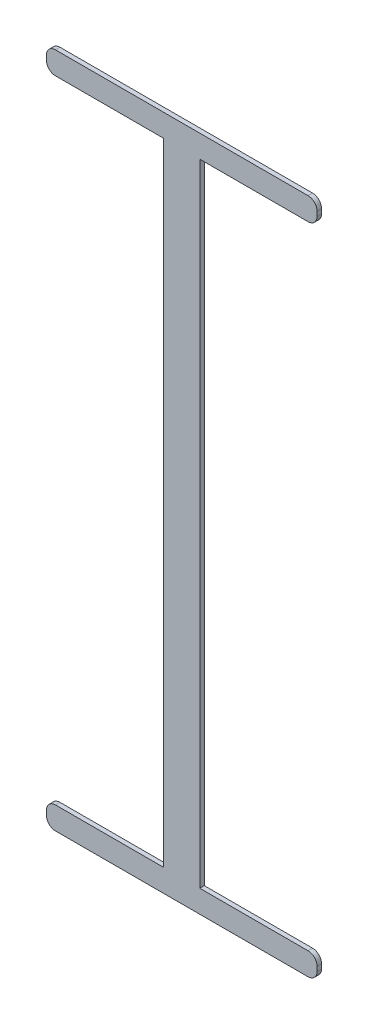
ISO-10303-21;
HEADER;
FILE_DESCRIPTION(('STEP AP214'),'2;1');
FILE_NAME('part.step','',(''),(''),'','','');
FILE_SCHEMA(('AUTOMOTIVE_DESIGN { 1 0 10303 214 1 1 1 1 }'));
ENDSEC;
DATA;
#1=APPLICATION_CONTEXT('core data for automotive mechanical design processes');
#2=APPLICATION_PROTOCOL_DEFINITION('international standard','automotive_design',2000,#1);
#3=PRODUCT_CONTEXT('',#1,'mechanical');
#4=PRODUCT('Part','Part','',(#3));
#5=PRODUCT_RELATED_PRODUCT_CATEGORY('part','',(#4));
#6=PRODUCT_DEFINITION_FORMATION('','',#4);
#7=PRODUCT_DEFINITION_CONTEXT('part definition',#1,'design');
#8=PRODUCT_DEFINITION('design','',#6,#7);
#9=PRODUCT_DEFINITION_SHAPE('','',#8);
#10=(LENGTH_UNIT() NAMED_UNIT(*) SI_UNIT(.MILLI.,.METRE.));
#11=(NAMED_UNIT(*) PLANE_ANGLE_UNIT() SI_UNIT($,.RADIAN.));
#12=(NAMED_UNIT(*) SI_UNIT($,.STERADIAN.) SOLID_ANGLE_UNIT());
#13=UNCERTAINTY_MEASURE_WITH_UNIT(LENGTH_MEASURE(1.E-05),#10,'distance_accuracy_value','');
#14=(GEOMETRIC_REPRESENTATION_CONTEXT(3) GLOBAL_UNCERTAINTY_ASSIGNED_CONTEXT((#13)) GLOBAL_UNIT_ASSIGNED_CONTEXT((#10,
#11,#12)) REPRESENTATION_CONTEXT('',''));
#15=CARTESIAN_POINT('',(0.,0.,0.));
#16=DIRECTION('',(0.,0.,1.));
#17=DIRECTION('',(1.,0.,0.));
#18=AXIS2_PLACEMENT_3D('',#15,#16,#17);
#19=CARTESIAN_POINT('',(8.00000000000002,140.,2.));
#20=DIRECTION('',(-1.,0.,0.));
#21=DIRECTION('',(0.,0.,1.));
#22=AXIS2_PLACEMENT_3D('',#19,#20,#21);
#23=PLANE('',#22);
#24=DIRECTION('',(0.,1.,0.));
#25=VECTOR('',#24,1.);
#26=CARTESIAN_POINT('',(8.00000000000002,140.,0.));
#27=LINE('',#26,#25);
#28=CARTESIAN_POINT('',(8.00000000000002,-140.,0.));
#29=VERTEX_POINT('',#28);
#30=CARTESIAN_POINT('',(8.00000000000002,140.,0.));
#31=VERTEX_POINT('',#30);
#32=EDGE_CURVE('E204',#29,#31,#27,.T.);
#33=ORIENTED_EDGE('',*,*,#32,.T.);
#34=DIRECTION('',(0.,0.,-1.));
#35=VECTOR('',#34,1.);
#36=CARTESIAN_POINT('',(8.00000000000002,140.,2.));
#37=LINE('',#36,#35);
#38=CARTESIAN_POINT('',(8.00000000000002,140.,2.));
#39=VERTEX_POINT('',#38);
#40=EDGE_CURVE('E11',#39,#31,#37,.T.);
#41=ORIENTED_EDGE('',*,*,#40,.F.);
#42=DIRECTION('',(0.,1.,0.));
#43=VECTOR('',#42,1.);
#44=CARTESIAN_POINT('',(8.00000000000002,140.,2.));
#45=LINE('',#44,#43);
#46=CARTESIAN_POINT('',(8.00000000000002,-140.,2.));
#47=VERTEX_POINT('',#46);
#48=EDGE_CURVE('E242',#47,#39,#45,.T.);
#49=ORIENTED_EDGE('',*,*,#48,.F.);
#50=DIRECTION('',(0.,0.,-1.));
#51=VECTOR('',#50,1.);
#52=CARTESIAN_POINT('',(8.00000000000002,-140.,2.));
#53=LINE('',#52,#51);
#54=EDGE_CURVE('E200',#47,#29,#53,.T.);
#55=ORIENTED_EDGE('',*,*,#54,.T.);
#56=EDGE_LOOP('',(#33,#41,#49,#55));
#57=FACE_BOUND('',#56,.T.);
#58=ADVANCED_FACE('F36',(#57),#23,.F.);
#59=CARTESIAN_POINT('',(56.,140.,2.));
#60=DIRECTION('',(0.,1.,0.));
#61=DIRECTION('',(-1.,0.,0.));
#62=AXIS2_PLACEMENT_3D('',#59,#60,#61);
#63=PLANE('',#62);
#64=DIRECTION('',(1.,0.,0.));
#65=VECTOR('',#64,1.);
#66=CARTESIAN_POINT('',(56.,140.,0.));
#67=LINE('',#66,#65);
#68=CARTESIAN_POINT('',(56.,140.,0.));
#69=VERTEX_POINT('',#68);
#70=EDGE_CURVE('E207',#31,#69,#67,.T.);
#71=ORIENTED_EDGE('',*,*,#70,.T.);
#72=DIRECTION('',(0.,0.,-1.));
#73=VECTOR('',#72,1.);
#74=CARTESIAN_POINT('',(56.,140.,2.));
#75=LINE('',#74,#73);
#76=CARTESIAN_POINT('',(56.,140.,2.));
#77=VERTEX_POINT('',#76);
#78=EDGE_CURVE('E44',#77,#69,#75,.T.);
#79=ORIENTED_EDGE('',*,*,#78,.F.);
#80=DIRECTION('',(1.,0.,0.));
#81=VECTOR('',#80,1.);
#82=CARTESIAN_POINT('',(56.,140.,2.));
#83=LINE('',#82,#81);
#84=EDGE_CURVE('E131',#39,#77,#83,.T.);
#85=ORIENTED_EDGE('',*,*,#84,.F.);
#86=ORIENTED_EDGE('',*,*,#40,.T.);
#87=EDGE_LOOP('',(#71,#79,#85,#86));
#88=FACE_BOUND('',#87,.T.);
#89=ADVANCED_FACE('F360',(#88),#63,.F.);
#90=CARTESIAN_POINT('',(56.,144.,2.));
#91=DIRECTION('',(0.,0.,-1.));
#92=DIRECTION('',(-1.,0.,0.));
#93=AXIS2_PLACEMENT_3D('',#90,#91,#92);
#94=CYLINDRICAL_SURFACE('',#93,4.00000000000001);
#95=CARTESIAN_POINT('',(56.,144.,0.));
#96=DIRECTION('',(0.,0.,1.));
#97=DIRECTION('',(1.,0.,0.));
#98=AXIS2_PLACEMENT_3D('',#95,#96,#97);
#99=CIRCLE('',#98,4.00000000000001);
#100=CARTESIAN_POINT('',(60.,144.,0.));
#101=VERTEX_POINT('',#100);
#102=EDGE_CURVE('E209',#69,#101,#99,.T.);
#103=ORIENTED_EDGE('',*,*,#102,.T.);
#104=DIRECTION('',(0.,0.,-1.));
#105=VECTOR('',#104,1.);
#106=CARTESIAN_POINT('',(60.,144.,2.));
#107=LINE('',#106,#105);
#108=CARTESIAN_POINT('',(60.,144.,2.));
#109=VERTEX_POINT('',#108);
#110=EDGE_CURVE('E285',#109,#101,#107,.T.);
#111=ORIENTED_EDGE('',*,*,#110,.F.);
#112=CARTESIAN_POINT('',(56.,144.,2.));
#113=DIRECTION('',(0.,0.,1.));
#114=DIRECTION('',(1.,0.,0.));
#115=AXIS2_PLACEMENT_3D('',#112,#113,#114);
#116=CIRCLE('',#115,4.00000000000001);
#117=EDGE_CURVE('E293',#77,#109,#116,.T.);
#118=ORIENTED_EDGE('',*,*,#117,.F.);
#119=ORIENTED_EDGE('',*,*,#78,.T.);
#120=EDGE_LOOP('',(#103,#111,#118,#119));
#121=FACE_BOUND('',#120,.T.);
#122=ADVANCED_FACE('F291',(#121),#94,.T.);
#123=CARTESIAN_POINT('',(60.,146.,2.));
#124=DIRECTION('',(-1.,0.,0.));
#125=DIRECTION('',(0.,-1.,0.));
#126=AXIS2_PLACEMENT_3D('',#123,#124,#125);
#127=PLANE('',#126);
#128=DIRECTION('',(0.,1.,0.));
#129=VECTOR('',#128,1.);
#130=CARTESIAN_POINT('',(60.,146.,0.));
#131=LINE('',#130,#129);
#132=CARTESIAN_POINT('',(60.,146.,0.));
#133=VERTEX_POINT('',#132);
#134=EDGE_CURVE('E211',#101,#133,#131,.T.);
#135=ORIENTED_EDGE('',*,*,#134,.T.);
#136=DIRECTION('',(0.,0.,-1.));
#137=VECTOR('',#136,1.);
#138=CARTESIAN_POINT('',(60.,146.,2.));
#139=LINE('',#138,#137);
#140=CARTESIAN_POINT('',(60.,146.,2.));
#141=VERTEX_POINT('',#140);
#142=EDGE_CURVE('E282',#141,#133,#139,.T.);
#143=ORIENTED_EDGE('',*,*,#142,.F.);
#144=DIRECTION('',(0.,1.,0.));
#145=VECTOR('',#144,1.);
#146=CARTESIAN_POINT('',(60.,146.,2.));
#147=LINE('',#146,#145);
#148=EDGE_CURVE('E311',#109,#141,#147,.T.);
#149=ORIENTED_EDGE('',*,*,#148,.F.);
#150=ORIENTED_EDGE('',*,*,#110,.T.);
#151=EDGE_LOOP('',(#135,#143,#149,#150));
#152=FACE_BOUND('',#151,.T.);
#153=ADVANCED_FACE('F302',(#152),#127,.F.);
#154=CARTESIAN_POINT('',(56.,146.,2.));
#155=DIRECTION('',(0.,0.,-1.));
#156=DIRECTION('',(-1.,0.,0.));
#157=AXIS2_PLACEMENT_3D('',#154,#155,#156);
#158=CYLINDRICAL_SURFACE('',#157,4.);
#159=CARTESIAN_POINT('',(56.,146.,0.));
#160=DIRECTION('',(0.,0.,1.));
#161=DIRECTION('',(1.,0.,0.));
#162=AXIS2_PLACEMENT_3D('',#159,#160,#161);
#163=CIRCLE('',#162,4.);
#164=CARTESIAN_POINT('',(56.,150.,0.));
#165=VERTEX_POINT('',#164);
#166=EDGE_CURVE('E213',#133,#165,#163,.T.);
#167=ORIENTED_EDGE('',*,*,#166,.T.);
#168=DIRECTION('',(0.,0.,-1.));
#169=VECTOR('',#168,1.);
#170=CARTESIAN_POINT('',(56.,150.,2.));
#171=LINE('',#170,#169);
#172=CARTESIAN_POINT('',(56.,150.,2.));
#173=VERTEX_POINT('',#172);
#174=EDGE_CURVE('E279',#173,#165,#171,.T.);
#175=ORIENTED_EDGE('',*,*,#174,.F.);
#176=CARTESIAN_POINT('',(56.,146.,2.));
#177=DIRECTION('',(0.,0.,1.));
#178=DIRECTION('',(1.,0.,0.));
#179=AXIS2_PLACEMENT_3D('',#176,#177,#178);
#180=CIRCLE('',#179,4.);
#181=EDGE_CURVE('E308',#141,#173,#180,.T.);
#182=ORIENTED_EDGE('',*,*,#181,.F.);
#183=ORIENTED_EDGE('',*,*,#142,.T.);
#184=EDGE_LOOP('',(#167,#175,#182,#183));
#185=FACE_BOUND('',#184,.T.);
#186=ADVANCED_FACE('F306',(#185),#158,.T.);
#187=CARTESIAN_POINT('',(-56.,150.,2.));
#188=DIRECTION('',(0.,-1.,0.));
#189=DIRECTION('',(0.,0.,-1.));
#190=AXIS2_PLACEMENT_3D('',#187,#188,#189);
#191=PLANE('',#190);
#192=DIRECTION('',(-1.,0.,0.));
#193=VECTOR('',#192,1.);
#194=CARTESIAN_POINT('',(-56.,150.,0.));
#195=LINE('',#194,#193);
#196=CARTESIAN_POINT('',(-56.,150.,0.));
#197=VERTEX_POINT('',#196);
#198=EDGE_CURVE('E215',#165,#197,#195,.T.);
#199=ORIENTED_EDGE('',*,*,#198,.T.);
#200=DIRECTION('',(0.,0.,-1.));
#201=VECTOR('',#200,1.);
#202=CARTESIAN_POINT('',(-56.,150.,2.));
#203=LINE('',#202,#201);
#204=CARTESIAN_POINT('',(-56.,150.,2.));
#205=VERTEX_POINT('',#204);
#206=EDGE_CURVE('E276',#205,#197,#203,.T.);
#207=ORIENTED_EDGE('',*,*,#206,.F.);
#208=DIRECTION('',(-1.,0.,0.));
#209=VECTOR('',#208,1.);
#210=CARTESIAN_POINT('',(-56.,150.,2.));
#211=LINE('',#210,#209);
#212=EDGE_CURVE('E310',#173,#205,#211,.T.);
#213=ORIENTED_EDGE('',*,*,#212,.F.);
#214=ORIENTED_EDGE('',*,*,#174,.T.);
#215=EDGE_LOOP('',(#199,#207,#213,#214));
#216=FACE_BOUND('',#215,.T.);
#217=ADVANCED_FACE('F373',(#216),#191,.F.);
#218=CARTESIAN_POINT('',(-56.,146.,2.));
#219=DIRECTION('',(0.,0.,-1.));
#220=DIRECTION('',(-1.,0.,0.));
#221=AXIS2_PLACEMENT_3D('',#218,#219,#220);
#222=CYLINDRICAL_SURFACE('',#221,4.);
#223=CARTESIAN_POINT('',(-56.,146.,0.));
#224=DIRECTION('',(0.,0.,1.));
#225=DIRECTION('',(-1.,0.,0.));
#226=AXIS2_PLACEMENT_3D('',#223,#224,#225);
#227=CIRCLE('',#226,4.);
#228=CARTESIAN_POINT('',(-60.,146.,0.));
#229=VERTEX_POINT('',#228);
#230=EDGE_CURVE('E217',#197,#229,#227,.T.);
#231=ORIENTED_EDGE('',*,*,#230,.T.);
#232=DIRECTION('',(0.,0.,-1.));
#233=VECTOR('',#232,1.);
#234=CARTESIAN_POINT('',(-60.,146.,2.));
#235=LINE('',#234,#233);
#236=CARTESIAN_POINT('',(-60.,146.,2.));
#237=VERTEX_POINT('',#236);
#238=EDGE_CURVE('E273',#237,#229,#235,.T.);
#239=ORIENTED_EDGE('',*,*,#238,.F.);
#240=CARTESIAN_POINT('',(-56.,146.,2.));
#241=DIRECTION('',(0.,0.,1.));
#242=DIRECTION('',(-1.,0.,0.));
#243=AXIS2_PLACEMENT_3D('',#240,#241,#242);
#244=CIRCLE('',#243,4.);
#245=EDGE_CURVE('E313',#205,#237,#244,.T.);
#246=ORIENTED_EDGE('',*,*,#245,.F.);
#247=ORIENTED_EDGE('',*,*,#206,.T.);
#248=EDGE_LOOP('',(#231,#239,#246,#247));
#249=FACE_BOUND('',#248,.T.);
#250=ADVANCED_FACE('F376',(#249),#222,.T.);
#251=CARTESIAN_POINT('',(-60.,146.,2.));
#252=DIRECTION('',(1.,0.,0.));
#253=DIRECTION('',(0.,1.,0.));
#254=AXIS2_PLACEMENT_3D('',#251,#252,#253);
#255=PLANE('',#254);
#256=DIRECTION('',(0.,-1.,0.));
#257=VECTOR('',#256,1.);
#258=CARTESIAN_POINT('',(-60.,146.,0.));
#259=LINE('',#258,#257);
#260=CARTESIAN_POINT('',(-60.,144.,0.));
#261=VERTEX_POINT('',#260);
#262=EDGE_CURVE('E219',#229,#261,#259,.T.);
#263=ORIENTED_EDGE('',*,*,#262,.T.);
#264=DIRECTION('',(0.,0.,-1.));
#265=VECTOR('',#264,1.);
#266=CARTESIAN_POINT('',(-60.,144.,2.));
#267=LINE('',#266,#265);
#268=CARTESIAN_POINT('',(-60.,144.,2.));
#269=VERTEX_POINT('',#268);
#270=EDGE_CURVE('E270',#269,#261,#267,.T.);
#271=ORIENTED_EDGE('',*,*,#270,.F.);
#272=DIRECTION('',(0.,-1.,0.));
#273=VECTOR('',#272,1.);
#274=CARTESIAN_POINT('',(-60.,146.,2.));
#275=LINE('',#274,#273);
#276=EDGE_CURVE('E319',#237,#269,#275,.T.);
#277=ORIENTED_EDGE('',*,*,#276,.F.);
#278=ORIENTED_EDGE('',*,*,#238,.T.);
#279=EDGE_LOOP('',(#263,#271,#277,#278));
#280=FACE_BOUND('',#279,.T.);
#281=ADVANCED_FACE('F380',(#280),#255,.F.);
#282=CARTESIAN_POINT('',(-56.,144.,2.));
#283=DIRECTION('',(0.,0.,-1.));
#284=DIRECTION('',(-1.,0.,0.));
#285=AXIS2_PLACEMENT_3D('',#282,#283,#284);
#286=CYLINDRICAL_SURFACE('',#285,4.00000000000001);
#287=CARTESIAN_POINT('',(-56.,144.,0.));
#288=DIRECTION('',(0.,0.,1.));
#289=DIRECTION('',(-1.,0.,0.));
#290=AXIS2_PLACEMENT_3D('',#287,#288,#289);
#291=CIRCLE('',#290,4.00000000000001);
#292=CARTESIAN_POINT('',(-56.,140.,0.));
#293=VERTEX_POINT('',#292);
#294=EDGE_CURVE('E221',#261,#293,#291,.T.);
#295=ORIENTED_EDGE('',*,*,#294,.T.);
#296=DIRECTION('',(0.,0.,-1.));
#297=VECTOR('',#296,1.);
#298=CARTESIAN_POINT('',(-56.,140.,2.));
#299=LINE('',#298,#297);
#300=CARTESIAN_POINT('',(-56.,140.,2.));
#301=VERTEX_POINT('',#300);
#302=EDGE_CURVE('E267',#301,#293,#299,.T.);
#303=ORIENTED_EDGE('',*,*,#302,.F.);
#304=CARTESIAN_POINT('',(-56.,144.,2.));
#305=DIRECTION('',(0.,0.,1.));
#306=DIRECTION('',(-1.,0.,0.));
#307=AXIS2_PLACEMENT_3D('',#304,#305,#306);
#308=CIRCLE('',#307,4.00000000000001);
#309=EDGE_CURVE('E321',#269,#301,#308,.T.);
#310=ORIENTED_EDGE('',*,*,#309,.F.);
#311=ORIENTED_EDGE('',*,*,#270,.T.);
#312=EDGE_LOOP('',(#295,#303,#310,#311));
#313=FACE_BOUND('',#312,.T.);
#314=ADVANCED_FACE('F384',(#313),#286,.T.);
#315=CARTESIAN_POINT('',(-56.,140.,2.));
#316=DIRECTION('',(0.,1.,0.));
#317=DIRECTION('',(-1.,0.,0.));
#318=AXIS2_PLACEMENT_3D('',#315,#316,#317);
#319=PLANE('',#318);
#320=DIRECTION('',(1.,0.,0.));
#321=VECTOR('',#320,1.);
#322=CARTESIAN_POINT('',(-56.,140.,0.));
#323=LINE('',#322,#321);
#324=CARTESIAN_POINT('',(-8.00000000000002,140.,0.));
#325=VERTEX_POINT('',#324);
#326=EDGE_CURVE('E223',#293,#325,#323,.T.);
#327=ORIENTED_EDGE('',*,*,#326,.T.);
#328=DIRECTION('',(0.,0.,-1.));
#329=VECTOR('',#328,1.);
#330=CARTESIAN_POINT('',(-8.00000000000002,140.,2.));
#331=LINE('',#330,#329);
#332=CARTESIAN_POINT('',(-8.00000000000002,140.,2.));
#333=VERTEX_POINT('',#332);
#334=EDGE_CURVE('E264',#333,#325,#331,.T.);
#335=ORIENTED_EDGE('',*,*,#334,.F.);
#336=DIRECTION('',(1.,0.,0.));
#337=VECTOR('',#336,1.);
#338=CARTESIAN_POINT('',(-56.,140.,2.));
#339=LINE('',#338,#337);
#340=EDGE_CURVE('E323',#301,#333,#339,.T.);
#341=ORIENTED_EDGE('',*,*,#340,.F.);
#342=ORIENTED_EDGE('',*,*,#302,.T.);
#343=EDGE_LOOP('',(#327,#335,#341,#342));
#344=FACE_BOUND('',#343,.T.);
#345=ADVANCED_FACE('F388',(#344),#319,.F.);
#346=CARTESIAN_POINT('',(-8.00000000000002,140.,2.));
#347=DIRECTION('',(1.,0.,0.));
#348=DIRECTION('',(0.,0.,-1.));
#349=AXIS2_PLACEMENT_3D('',#346,#347,#348);
#350=PLANE('',#349);
#351=DIRECTION('',(0.,-1.,0.));
#352=VECTOR('',#351,1.);
#353=CARTESIAN_POINT('',(-8.00000000000002,140.,0.));
#354=LINE('',#353,#352);
#355=CARTESIAN_POINT('',(-8.00000000000002,-140.,0.));
#356=VERTEX_POINT('',#355);
#357=EDGE_CURVE('E225',#325,#356,#354,.T.);
#358=ORIENTED_EDGE('',*,*,#357,.T.);
#359=DIRECTION('',(0.,0.,-1.));
#360=VECTOR('',#359,1.);
#361=CARTESIAN_POINT('',(-8.00000000000002,-140.,2.));
#362=LINE('',#361,#360);
#363=CARTESIAN_POINT('',(-8.00000000000002,-140.,2.));
#364=VERTEX_POINT('',#363);
#365=EDGE_CURVE('E261',#364,#356,#362,.T.);
#366=ORIENTED_EDGE('',*,*,#365,.F.);
#367=DIRECTION('',(0.,-1.,0.));
#368=VECTOR('',#367,1.);
#369=CARTESIAN_POINT('',(-8.00000000000002,140.,2.));
#370=LINE('',#369,#368);
#371=EDGE_CURVE('E325',#333,#364,#370,.T.);
#372=ORIENTED_EDGE('',*,*,#371,.F.);
#373=ORIENTED_EDGE('',*,*,#334,.T.);
#374=EDGE_LOOP('',(#358,#366,#372,#373));
#375=FACE_BOUND('',#374,.T.);
#376=ADVANCED_FACE('F392',(#375),#350,.F.);
#377=CARTESIAN_POINT('',(-56.,-140.,2.));
#378=DIRECTION('',(0.,-1.,0.));
#379=DIRECTION('',(1.,0.,0.));
#380=AXIS2_PLACEMENT_3D('',#377,#378,#379);
#381=PLANE('',#380);
#382=DIRECTION('',(-1.,0.,0.));
#383=VECTOR('',#382,1.);
#384=CARTESIAN_POINT('',(-56.,-140.,0.));
#385=LINE('',#384,#383);
#386=CARTESIAN_POINT('',(-56.,-140.,0.));
#387=VERTEX_POINT('',#386);
#388=EDGE_CURVE('E227',#356,#387,#385,.T.);
#389=ORIENTED_EDGE('',*,*,#388,.T.);
#390=DIRECTION('',(0.,0.,-1.));
#391=VECTOR('',#390,1.);
#392=CARTESIAN_POINT('',(-56.,-140.,2.));
#393=LINE('',#392,#391);
#394=CARTESIAN_POINT('',(-56.,-140.,2.));
#395=VERTEX_POINT('',#394);
#396=EDGE_CURVE('E258',#395,#387,#393,.T.);
#397=ORIENTED_EDGE('',*,*,#396,.F.);
#398=DIRECTION('',(-1.,0.,0.));
#399=VECTOR('',#398,1.);
#400=CARTESIAN_POINT('',(-56.,-140.,2.));
#401=LINE('',#400,#399);
#402=EDGE_CURVE('E327',#364,#395,#401,.T.);
#403=ORIENTED_EDGE('',*,*,#402,.F.);
#404=ORIENTED_EDGE('',*,*,#365,.T.);
#405=EDGE_LOOP('',(#389,#397,#403,#404));
#406=FACE_BOUND('',#405,.T.);
#407=ADVANCED_FACE('F396',(#406),#381,.F.);
#408=CARTESIAN_POINT('',(-56.,-144.,2.));
#409=DIRECTION('',(0.,0.,-1.));
#410=DIRECTION('',(-1.,0.,0.));
#411=AXIS2_PLACEMENT_3D('',#408,#409,#410);
#412=CYLINDRICAL_SURFACE('',#411,4.00000000000001);
#413=CARTESIAN_POINT('',(-56.,-144.,0.));
#414=DIRECTION('',(0.,0.,1.));
#415=DIRECTION('',(1.,0.,0.));
#416=AXIS2_PLACEMENT_3D('',#413,#414,#415);
#417=CIRCLE('',#416,4.00000000000001);
#418=CARTESIAN_POINT('',(-60.,-144.,0.));
#419=VERTEX_POINT('',#418);
#420=EDGE_CURVE('E229',#387,#419,#417,.T.);
#421=ORIENTED_EDGE('',*,*,#420,.T.);
#422=DIRECTION('',(0.,0.,-1.));
#423=VECTOR('',#422,1.);
#424=CARTESIAN_POINT('',(-60.,-144.,2.));
#425=LINE('',#424,#423);
#426=CARTESIAN_POINT('',(-60.,-144.,2.));
#427=VERTEX_POINT('',#426);
#428=EDGE_CURVE('E255',#427,#419,#425,.T.);
#429=ORIENTED_EDGE('',*,*,#428,.F.);
#430=CARTESIAN_POINT('',(-56.,-144.,2.));
#431=DIRECTION('',(0.,0.,1.));
#432=DIRECTION('',(1.,0.,0.));
#433=AXIS2_PLACEMENT_3D('',#430,#431,#432);
#434=CIRCLE('',#433,4.00000000000001);
#435=EDGE_CURVE('E329',#395,#427,#434,.T.);
#436=ORIENTED_EDGE('',*,*,#435,.F.);
#437=ORIENTED_EDGE('',*,*,#396,.T.);
#438=EDGE_LOOP('',(#421,#429,#436,#437));
#439=FACE_BOUND('',#438,.T.);
#440=ADVANCED_FACE('F400',(#439),#412,.T.);
#441=CARTESIAN_POINT('',(-60.,-146.,2.));
#442=DIRECTION('',(1.,0.,0.));
#443=DIRECTION('',(0.,1.,0.));
#444=AXIS2_PLACEMENT_3D('',#441,#442,#443);
#445=PLANE('',#444);
#446=DIRECTION('',(0.,-1.,0.));
#447=VECTOR('',#446,1.);
#448=CARTESIAN_POINT('',(-60.,-146.,0.));
#449=LINE('',#448,#447);
#450=CARTESIAN_POINT('',(-60.,-146.,0.));
#451=VERTEX_POINT('',#450);
#452=EDGE_CURVE('E231',#419,#451,#449,.T.);
#453=ORIENTED_EDGE('',*,*,#452,.T.);
#454=DIRECTION('',(0.,0.,-1.));
#455=VECTOR('',#454,1.);
#456=CARTESIAN_POINT('',(-60.,-146.,2.));
#457=LINE('',#456,#455);
#458=CARTESIAN_POINT('',(-60.,-146.,2.));
#459=VERTEX_POINT('',#458);
#460=EDGE_CURVE('E252',#459,#451,#457,.T.);
#461=ORIENTED_EDGE('',*,*,#460,.F.);
#462=DIRECTION('',(0.,-1.,0.));
#463=VECTOR('',#462,1.);
#464=CARTESIAN_POINT('',(-60.,-146.,2.));
#465=LINE('',#464,#463);
#466=EDGE_CURVE('E331',#427,#459,#465,.T.);
#467=ORIENTED_EDGE('',*,*,#466,.F.);
#468=ORIENTED_EDGE('',*,*,#428,.T.);
#469=EDGE_LOOP('',(#453,#461,#467,#468));
#470=FACE_BOUND('',#469,.T.);
#471=ADVANCED_FACE('F404',(#470),#445,.F.);
#472=CARTESIAN_POINT('',(-56.,-146.,2.));
#473=DIRECTION('',(0.,0.,-1.));
#474=DIRECTION('',(-1.,0.,0.));
#475=AXIS2_PLACEMENT_3D('',#472,#473,#474);
#476=CYLINDRICAL_SURFACE('',#475,4.);
#477=CARTESIAN_POINT('',(-56.,-146.,0.));
#478=DIRECTION('',(0.,0.,1.));
#479=DIRECTION('',(1.,0.,0.));
#480=AXIS2_PLACEMENT_3D('',#477,#478,#479);
#481=CIRCLE('',#480,4.);
#482=CARTESIAN_POINT('',(-56.,-150.,0.));
#483=VERTEX_POINT('',#482);
#484=EDGE_CURVE('E233',#451,#483,#481,.T.);
#485=ORIENTED_EDGE('',*,*,#484,.T.);
#486=DIRECTION('',(0.,0.,-1.));
#487=VECTOR('',#486,1.);
#488=CARTESIAN_POINT('',(-56.,-150.,2.));
#489=LINE('',#488,#487);
#490=CARTESIAN_POINT('',(-56.,-150.,2.));
#491=VERTEX_POINT('',#490);
#492=EDGE_CURVE('E249',#491,#483,#489,.T.);
#493=ORIENTED_EDGE('',*,*,#492,.F.);
#494=CARTESIAN_POINT('',(-56.,-146.,2.));
#495=DIRECTION('',(0.,0.,1.));
#496=DIRECTION('',(1.,0.,0.));
#497=AXIS2_PLACEMENT_3D('',#494,#495,#496);
#498=CIRCLE('',#497,4.);
#499=EDGE_CURVE('E333',#459,#491,#498,.T.);
#500=ORIENTED_EDGE('',*,*,#499,.F.);
#501=ORIENTED_EDGE('',*,*,#460,.T.);
#502=EDGE_LOOP('',(#485,#493,#500,#501));
#503=FACE_BOUND('',#502,.T.);
#504=ADVANCED_FACE('F408',(#503),#476,.T.);
#505=CARTESIAN_POINT('',(-56.,-150.,2.));
#506=DIRECTION('',(0.,1.,0.));
#507=DIRECTION('',(0.,0.,1.));
#508=AXIS2_PLACEMENT_3D('',#505,#506,#507);
#509=PLANE('',#508);
#510=DIRECTION('',(1.,0.,0.));
#511=VECTOR('',#510,1.);
#512=CARTESIAN_POINT('',(-56.,-150.,0.));
#513=LINE('',#512,#511);
#514=CARTESIAN_POINT('',(56.,-150.,0.));
#515=VERTEX_POINT('',#514);
#516=EDGE_CURVE('E235',#483,#515,#513,.T.);
#517=ORIENTED_EDGE('',*,*,#516,.T.);
#518=DIRECTION('',(0.,0.,-1.));
#519=VECTOR('',#518,1.);
#520=CARTESIAN_POINT('',(56.,-150.,2.));
#521=LINE('',#520,#519);
#522=CARTESIAN_POINT('',(56.,-150.,2.));
#523=VERTEX_POINT('',#522);
#524=EDGE_CURVE('E246',#523,#515,#521,.T.);
#525=ORIENTED_EDGE('',*,*,#524,.F.);
#526=DIRECTION('',(1.,0.,0.));
#527=VECTOR('',#526,1.);
#528=CARTESIAN_POINT('',(-56.,-150.,2.));
#529=LINE('',#528,#527);
#530=EDGE_CURVE('E335',#491,#523,#529,.T.);
#531=ORIENTED_EDGE('',*,*,#530,.F.);
#532=ORIENTED_EDGE('',*,*,#492,.T.);
#533=EDGE_LOOP('',(#517,#525,#531,#532));
#534=FACE_BOUND('',#533,.T.);
#535=ADVANCED_FACE('F341',(#534),#509,.F.);
#536=CARTESIAN_POINT('',(56.,-146.,2.));
#537=DIRECTION('',(0.,0.,-1.));
#538=DIRECTION('',(-1.,0.,0.));
#539=AXIS2_PLACEMENT_3D('',#536,#537,#538);
#540=CYLINDRICAL_SURFACE('',#539,4.);
#541=CARTESIAN_POINT('',(56.,-146.,0.));
#542=DIRECTION('',(0.,0.,1.));
#543=DIRECTION('',(-1.,0.,0.));
#544=AXIS2_PLACEMENT_3D('',#541,#542,#543);
#545=CIRCLE('',#544,4.);
#546=CARTESIAN_POINT('',(60.,-146.,0.));
#547=VERTEX_POINT('',#546);
#548=EDGE_CURVE('E237',#515,#547,#545,.T.);
#549=ORIENTED_EDGE('',*,*,#548,.T.);
#550=DIRECTION('',(0.,0.,-1.));
#551=VECTOR('',#550,1.);
#552=CARTESIAN_POINT('',(60.,-146.,2.));
#553=LINE('',#552,#551);
#554=CARTESIAN_POINT('',(60.,-146.,2.));
#555=VERTEX_POINT('',#554);
#556=EDGE_CURVE('E195',#555,#547,#553,.T.);
#557=ORIENTED_EDGE('',*,*,#556,.F.);
#558=CARTESIAN_POINT('',(56.,-146.,2.));
#559=DIRECTION('',(0.,0.,1.));
#560=DIRECTION('',(-1.,0.,0.));
#561=AXIS2_PLACEMENT_3D('',#558,#559,#560);
#562=CIRCLE('',#561,4.);
#563=EDGE_CURVE('E186',#523,#555,#562,.T.);
#564=ORIENTED_EDGE('',*,*,#563,.F.);
#565=ORIENTED_EDGE('',*,*,#524,.T.);
#566=EDGE_LOOP('',(#549,#557,#564,#565));
#567=FACE_BOUND('',#566,.T.);
#568=ADVANCED_FACE('F345',(#567),#540,.T.);
#569=CARTESIAN_POINT('',(60.,-146.,2.));
#570=DIRECTION('',(-1.,0.,0.));
#571=DIRECTION('',(0.,-1.,0.));
#572=AXIS2_PLACEMENT_3D('',#569,#570,#571);
#573=PLANE('',#572);
#574=DIRECTION('',(0.,1.,0.));
#575=VECTOR('',#574,1.);
#576=CARTESIAN_POINT('',(60.,-146.,0.));
#577=LINE('',#576,#575);
#578=CARTESIAN_POINT('',(60.,-144.,0.));
#579=VERTEX_POINT('',#578);
#580=EDGE_CURVE('E194',#547,#579,#577,.T.);
#581=ORIENTED_EDGE('',*,*,#580,.T.);
#582=DIRECTION('',(0.,0.,-1.));
#583=VECTOR('',#582,1.);
#584=CARTESIAN_POINT('',(60.,-144.,2.));
#585=LINE('',#584,#583);
#586=CARTESIAN_POINT('',(60.,-144.,2.));
#587=VERTEX_POINT('',#586);
#588=EDGE_CURVE('E191',#587,#579,#585,.T.);
#589=ORIENTED_EDGE('',*,*,#588,.F.);
#590=DIRECTION('',(0.,1.,0.));
#591=VECTOR('',#590,1.);
#592=CARTESIAN_POINT('',(60.,-146.,2.));
#593=LINE('',#592,#591);
#594=EDGE_CURVE('E180',#555,#587,#593,.T.);
#595=ORIENTED_EDGE('',*,*,#594,.F.);
#596=ORIENTED_EDGE('',*,*,#556,.T.);
#597=EDGE_LOOP('',(#581,#589,#595,#596));
#598=FACE_BOUND('',#597,.T.);
#599=ADVANCED_FACE('F192',(#598),#573,.F.);
#600=CARTESIAN_POINT('',(56.,-144.,2.));
#601=DIRECTION('',(0.,0.,-1.));
#602=DIRECTION('',(-1.,0.,0.));
#603=AXIS2_PLACEMENT_3D('',#600,#601,#602);
#604=CYLINDRICAL_SURFACE('',#603,4.00000000000001);
#605=CARTESIAN_POINT('',(56.,-144.,0.));
#606=DIRECTION('',(0.,0.,1.));
#607=DIRECTION('',(-1.,0.,0.));
#608=AXIS2_PLACEMENT_3D('',#605,#606,#607);
#609=CIRCLE('',#608,4.00000000000001);
#610=CARTESIAN_POINT('',(56.,-140.,0.));
#611=VERTEX_POINT('',#610);
#612=EDGE_CURVE('E117',#579,#611,#609,.T.);
#613=ORIENTED_EDGE('',*,*,#612,.T.);
#614=DIRECTION('',(0.,0.,-1.));
#615=VECTOR('',#614,1.);
#616=CARTESIAN_POINT('',(56.,-140.,2.));
#617=LINE('',#616,#615);
#618=CARTESIAN_POINT('',(56.,-140.,2.));
#619=VERTEX_POINT('',#618);
#620=EDGE_CURVE('E196',#619,#611,#617,.T.);
#621=ORIENTED_EDGE('',*,*,#620,.F.);
#622=CARTESIAN_POINT('',(56.,-144.,2.));
#623=DIRECTION('',(0.,0.,1.));
#624=DIRECTION('',(-1.,0.,0.));
#625=AXIS2_PLACEMENT_3D('',#622,#623,#624);
#626=CIRCLE('',#625,4.00000000000001);
#627=EDGE_CURVE('E184',#587,#619,#626,.T.);
#628=ORIENTED_EDGE('',*,*,#627,.F.);
#629=ORIENTED_EDGE('',*,*,#588,.T.);
#630=EDGE_LOOP('',(#613,#621,#628,#629));
#631=FACE_BOUND('',#630,.T.);
#632=ADVANCED_FACE('F198',(#631),#604,.T.);
#633=CARTESIAN_POINT('',(56.,-140.,2.));
#634=DIRECTION('',(0.,-1.,0.));
#635=DIRECTION('',(1.,0.,0.));
#636=AXIS2_PLACEMENT_3D('',#633,#634,#635);
#637=PLANE('',#636);
#638=DIRECTION('',(-1.,0.,0.));
#639=VECTOR('',#638,1.);
#640=CARTESIAN_POINT('',(56.,-140.,0.));
#641=LINE('',#640,#639);
#642=EDGE_CURVE('E123',#611,#29,#641,.T.);
#643=ORIENTED_EDGE('',*,*,#642,.T.);
#644=ORIENTED_EDGE('',*,*,#54,.F.);
#645=DIRECTION('',(-1.,0.,0.));
#646=VECTOR('',#645,1.);
#647=CARTESIAN_POINT('',(56.,-140.,2.));
#648=LINE('',#647,#646);
#649=EDGE_CURVE('E52',#619,#47,#648,.T.);
#650=ORIENTED_EDGE('',*,*,#649,.F.);
#651=ORIENTED_EDGE('',*,*,#620,.T.);
#652=EDGE_LOOP('',(#643,#644,#650,#651));
#653=FACE_BOUND('',#652,.T.);
#654=ADVANCED_FACE('F349',(#653),#637,.F.);
#655=CARTESIAN_POINT('',(56.,-144.,2.));
#656=DIRECTION('',(0.,0.,-1.));
#657=DIRECTION('',(-1.,0.,0.));
#658=AXIS2_PLACEMENT_3D('',#655,#656,#657);
#659=PLANE('',#658);
#660=ORIENTED_EDGE('',*,*,#48,.T.);
#661=ORIENTED_EDGE('',*,*,#84,.T.);
#662=ORIENTED_EDGE('',*,*,#117,.T.);
#663=ORIENTED_EDGE('',*,*,#148,.T.);
#664=ORIENTED_EDGE('',*,*,#181,.T.);
#665=ORIENTED_EDGE('',*,*,#212,.T.);
#666=ORIENTED_EDGE('',*,*,#245,.T.);
#667=ORIENTED_EDGE('',*,*,#276,.T.);
#668=ORIENTED_EDGE('',*,*,#309,.T.);
#669=ORIENTED_EDGE('',*,*,#340,.T.);
#670=ORIENTED_EDGE('',*,*,#371,.T.);
#671=ORIENTED_EDGE('',*,*,#402,.T.);
#672=ORIENTED_EDGE('',*,*,#435,.T.);
#673=ORIENTED_EDGE('',*,*,#466,.T.);
#674=ORIENTED_EDGE('',*,*,#499,.T.);
#675=ORIENTED_EDGE('',*,*,#530,.T.);
#676=ORIENTED_EDGE('',*,*,#563,.T.);
#677=ORIENTED_EDGE('',*,*,#594,.T.);
#678=ORIENTED_EDGE('',*,*,#627,.T.);
#679=ORIENTED_EDGE('',*,*,#649,.T.);
#680=EDGE_LOOP('',(#660,#661,#662,#663,#664,#665,#666,#667,#668,#669,#670,#671,#672,#673,#674,
#675,#676,#677,#678,#679));
#681=FACE_BOUND('',#680,.T.);
#682=ADVANCED_FACE('F182',(#681),#659,.F.);
#683=CARTESIAN_POINT('',(56.,-144.,0.));
#684=DIRECTION('',(0.,0.,-1.));
#685=DIRECTION('',(-1.,0.,0.));
#686=AXIS2_PLACEMENT_3D('',#683,#684,#685);
#687=PLANE('',#686);
#688=ORIENTED_EDGE('',*,*,#32,.F.);
#689=ORIENTED_EDGE('',*,*,#642,.F.);
#690=ORIENTED_EDGE('',*,*,#612,.F.);
#691=ORIENTED_EDGE('',*,*,#580,.F.);
#692=ORIENTED_EDGE('',*,*,#548,.F.);
#693=ORIENTED_EDGE('',*,*,#516,.F.);
#694=ORIENTED_EDGE('',*,*,#484,.F.);
#695=ORIENTED_EDGE('',*,*,#452,.F.);
#696=ORIENTED_EDGE('',*,*,#420,.F.);
#697=ORIENTED_EDGE('',*,*,#388,.F.);
#698=ORIENTED_EDGE('',*,*,#357,.F.);
#699=ORIENTED_EDGE('',*,*,#326,.F.);
#700=ORIENTED_EDGE('',*,*,#294,.F.);
#701=ORIENTED_EDGE('',*,*,#262,.F.);
#702=ORIENTED_EDGE('',*,*,#230,.F.);
#703=ORIENTED_EDGE('',*,*,#198,.F.);
#704=ORIENTED_EDGE('',*,*,#166,.F.);
#705=ORIENTED_EDGE('',*,*,#134,.F.);
#706=ORIENTED_EDGE('',*,*,#102,.F.);
#707=ORIENTED_EDGE('',*,*,#70,.F.);
#708=EDGE_LOOP('',(#688,#689,#690,#691,#692,#693,#694,#695,#696,#697,#698,#699,#700,#701,#702,
#703,#704,#705,#706,#707));
#709=FACE_BOUND('',#708,.T.);
#710=ADVANCED_FACE('F297',(#709),#687,.T.);
#711=CLOSED_SHELL('',(#58,#89,#122,#153,#186,#217,#250,#281,#314,#345,#376,#407,#440,#471,#504,
#535,#568,#599,#632,#654,#682,#710));
#712=MANIFOLD_SOLID_BREP('B2',#711);
#713=ADVANCED_BREP_SHAPE_REPRESENTATION('',(#18,#712),#14);
#714=SHAPE_DEFINITION_REPRESENTATION(#9,#713);
ENDSEC;
END-ISO-10303-21;
